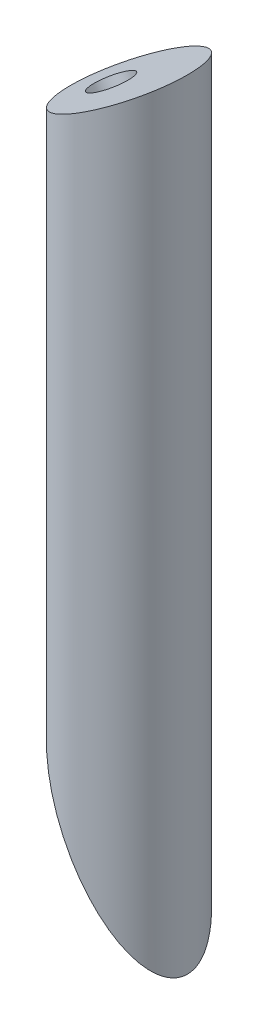
ISO-10303-21;
HEADER;
FILE_DESCRIPTION(('STEP AP214'),'2;1');
FILE_NAME('part.step','',(''),(''),'','','');
FILE_SCHEMA(('AUTOMOTIVE_DESIGN { 1 0 10303 214 1 1 1 1 }'));
ENDSEC;
DATA;
#1=APPLICATION_CONTEXT('core data for automotive mechanical design processes');
#2=APPLICATION_PROTOCOL_DEFINITION('international standard','automotive_design',2000,#1);
#3=PRODUCT_CONTEXT('',#1,'mechanical');
#4=PRODUCT('Part','Part','',(#3));
#5=PRODUCT_RELATED_PRODUCT_CATEGORY('part','',(#4));
#6=PRODUCT_DEFINITION_FORMATION('','',#4);
#7=PRODUCT_DEFINITION_CONTEXT('part definition',#1,'design');
#8=PRODUCT_DEFINITION('design','',#6,#7);
#9=PRODUCT_DEFINITION_SHAPE('','',#8);
#10=(LENGTH_UNIT() NAMED_UNIT(*) SI_UNIT(.MILLI.,.METRE.));
#11=(NAMED_UNIT(*) PLANE_ANGLE_UNIT() SI_UNIT($,.RADIAN.));
#12=(NAMED_UNIT(*) SI_UNIT($,.STERADIAN.) SOLID_ANGLE_UNIT());
#13=UNCERTAINTY_MEASURE_WITH_UNIT(LENGTH_MEASURE(1.E-05),#10,'distance_accuracy_value','');
#14=(GEOMETRIC_REPRESENTATION_CONTEXT(3) GLOBAL_UNCERTAINTY_ASSIGNED_CONTEXT((#13)) GLOBAL_UNIT_ASSIGNED_CONTEXT((#10,
#11,#12)) REPRESENTATION_CONTEXT('',''));
#15=CARTESIAN_POINT('',(0.,0.,0.));
#16=DIRECTION('',(0.,0.,1.));
#17=DIRECTION('',(1.,0.,0.));
#18=AXIS2_PLACEMENT_3D('',#15,#16,#17);
#19=CARTESIAN_POINT('',(0.,100.,0.));
#20=DIRECTION('',(0.,-1.,0.));
#21=DIRECTION('',(0.,0.,-1.));
#22=AXIS2_PLACEMENT_3D('',#19,#20,#21);
#23=CYLINDRICAL_SURFACE('',#22,7.5);
#24=CARTESIAN_POINT('',(0.,12.9903810567666,0.));
#25=DIRECTION('',(0.86602540378444,0.499999999999998,0.));
#26=DIRECTION('',(0.499999999999998,-0.86602540378444,0.));
#27=AXIS2_PLACEMENT_3D('',#24,#25,#26);
#28=ELLIPSE('',#27,15.0000000000001,7.5);
#29=CARTESIAN_POINT('',(7.5,0.,0.));
#30=VERTEX_POINT('',#29);
#31=EDGE_CURVE('E37',#30,#30,#28,.T.);
#32=ORIENTED_EDGE('',*,*,#31,.T.);
#33=EDGE_LOOP('',(#32));
#34=FACE_BOUND('',#33,.T.);
#35=CARTESIAN_POINT('',(0.,95.6698729810778,0.));
#36=DIRECTION('',(0.500000000000001,-0.866025403784438,0.));
#37=DIRECTION('',(-0.866025403784438,-0.500000000000001,0.));
#38=AXIS2_PLACEMENT_3D('',#35,#36,#37);
#39=ELLIPSE('',#38,8.66025403784439,7.5);
#40=CARTESIAN_POINT('',(-7.5,91.3397459621556,0.));
#41=VERTEX_POINT('',#40);
#42=EDGE_CURVE('E10',#41,#41,#39,.T.);
#43=ORIENTED_EDGE('',*,*,#42,.T.);
#44=EDGE_LOOP('',(#43));
#45=FACE_BOUND('',#44,.T.);
#46=ADVANCED_FACE('F31',(#34,#45),#23,.T.);
#47=CARTESIAN_POINT('',(7.5,100.,-50.));
#48=DIRECTION('',(0.500000000000001,-0.866025403784438,0.));
#49=DIRECTION('',(0.866025403784438,0.500000000000001,0.));
#50=AXIS2_PLACEMENT_3D('',#47,#48,#49);
#51=PLANE('',#50);
#52=CARTESIAN_POINT('',(-2.30384757729338,94.3397459621556,0.));
#53=DIRECTION('',(-0.500000000000001,0.866025403784438,0.));
#54=DIRECTION('',(-0.866025403784438,-0.500000000000001,0.));
#55=AXIS2_PLACEMENT_3D('',#52,#53,#54);
#56=CIRCLE('',#55,2.5);
#57=CARTESIAN_POINT('',(-4.46891108675447,93.0897459621556,0.));
#58=VERTEX_POINT('',#57);
#59=EDGE_CURVE('E45',#58,#58,#56,.T.);
#60=ORIENTED_EDGE('',*,*,#59,.F.);
#61=EDGE_LOOP('',(#60));
#62=FACE_BOUND('',#61,.T.);
#63=ORIENTED_EDGE('',*,*,#42,.F.);
#64=EDGE_LOOP('',(#63));
#65=FACE_BOUND('',#64,.T.);
#66=ADVANCED_FACE('F70',(#62,#65),#51,.F.);
#67=CARTESIAN_POINT('',(-21.2216195760604,49.7473043814018,-50.));
#68=DIRECTION('',(0.86602540378444,0.499999999999998,0.));
#69=DIRECTION('',(-0.499999999999998,0.86602540378444,0.));
#70=AXIS2_PLACEMENT_3D('',#67,#68,#69);
#71=PLANE('',#70);
#72=CARTESIAN_POINT('',(-3.50000000000001,19.0525588832578,0.));
#73=DIRECTION('',(-0.86602540378444,-0.499999999999998,0.));
#74=DIRECTION('',(0.499999999999998,-0.86602540378444,0.));
#75=AXIS2_PLACEMENT_3D('',#72,#73,#74);
#76=CIRCLE('',#75,2.5);
#77=CARTESIAN_POINT('',(-2.25000000000002,16.8874953737967,0.));
#78=VERTEX_POINT('',#77);
#79=EDGE_CURVE('E51',#78,#78,#76,.T.);
#80=ORIENTED_EDGE('',*,*,#79,.F.);
#81=EDGE_LOOP('',(#80));
#82=FACE_BOUND('',#81,.T.);
#83=ORIENTED_EDGE('',*,*,#31,.F.);
#84=EDGE_LOOP('',(#83));
#85=FACE_BOUND('',#84,.T.);
#86=ADVANCED_FACE('F66',(#82,#85),#71,.F.);
#87=CARTESIAN_POINT('',(2.69615242270664,85.6794919243112,0.));
#88=DIRECTION('',(-0.500000000000001,0.866025403784438,0.));
#89=DIRECTION('',(-0.866025403784438,-0.500000000000001,0.));
#90=AXIS2_PLACEMENT_3D('',#87,#88,#89);
#91=CYLINDRICAL_SURFACE('',#90,2.5);
#92=CARTESIAN_POINT('',(2.69615242270664,85.6794919243112,0.));
#93=DIRECTION('',(-0.500000000000001,0.866025403784438,0.));
#94=DIRECTION('',(-0.866025403784438,-0.500000000000001,0.));
#95=AXIS2_PLACEMENT_3D('',#92,#93,#94);
#96=CIRCLE('',#95,2.5);
#97=CARTESIAN_POINT('',(0.531088913245541,84.4294919243112,0.));
#98=VERTEX_POINT('',#97);
#99=EDGE_CURVE('E41',#98,#98,#96,.T.);
#100=ORIENTED_EDGE('',*,*,#99,.F.);
#101=EDGE_LOOP('',(#100));
#102=FACE_BOUND('',#101,.T.);
#103=ORIENTED_EDGE('',*,*,#59,.T.);
#104=EDGE_LOOP('',(#103));
#105=FACE_BOUND('',#104,.T.);
#106=ADVANCED_FACE('F69',(#102,#105),#91,.F.);
#107=CARTESIAN_POINT('',(-36.426270189222,63.0921506979639,0.));
#108=DIRECTION('',(-0.500000000000001,0.866025403784438,0.));
#109=DIRECTION('',(-0.866025403784438,-0.500000000000001,0.));
#110=AXIS2_PLACEMENT_3D('',#107,#108,#109);
#111=PLANE('',#110);
#112=ORIENTED_EDGE('',*,*,#99,.T.);
#113=EDGE_LOOP('',(#112));
#114=FACE_BOUND('',#113,.T.);
#115=ADVANCED_FACE('F62',(#114),#111,.T.);
#116=CARTESIAN_POINT('',(2.56217782649106,22.5525588832578,0.));
#117=DIRECTION('',(-0.86602540378444,-0.499999999999998,0.));
#118=DIRECTION('',(0.499999999999998,-0.86602540378444,0.));
#119=AXIS2_PLACEMENT_3D('',#116,#117,#118);
#120=CYLINDRICAL_SURFACE('',#119,2.5);
#121=CARTESIAN_POINT('',(2.56217782649106,22.5525588832578,0.));
#122=DIRECTION('',(-0.86602540378444,-0.499999999999998,0.));
#123=DIRECTION('',(0.499999999999998,-0.86602540378444,0.));
#124=AXIS2_PLACEMENT_3D('',#121,#122,#123);
#125=CIRCLE('',#124,2.5);
#126=CARTESIAN_POINT('',(3.81217782649106,20.3874953737967,0.));
#127=VERTEX_POINT('',#126);
#128=EDGE_CURVE('E49',#127,#127,#125,.T.);
#129=ORIENTED_EDGE('',*,*,#128,.F.);
#130=EDGE_LOOP('',(#129));
#131=FACE_BOUND('',#130,.T.);
#132=ORIENTED_EDGE('',*,*,#79,.T.);
#133=EDGE_LOOP('',(#132));
#134=FACE_BOUND('',#133,.T.);
#135=ADVANCED_FACE('F59',(#131,#134),#120,.F.);
#136=CARTESIAN_POINT('',(2.56217782649106,22.5525588832578,0.));
#137=DIRECTION('',(-0.86602540378444,-0.499999999999998,0.));
#138=DIRECTION('',(0.499999999999998,-0.86602540378444,0.));
#139=AXIS2_PLACEMENT_3D('',#136,#137,#138);
#140=PLANE('',#139);
#141=ORIENTED_EDGE('',*,*,#128,.T.);
#142=EDGE_LOOP('',(#141));
#143=FACE_BOUND('',#142,.T.);
#144=ADVANCED_FACE('F57',(#143),#140,.T.);
#145=CLOSED_SHELL('',(#46,#66,#86,#106,#115,#135,#144));
#146=MANIFOLD_SOLID_BREP('B2',#145);
#147=ADVANCED_BREP_SHAPE_REPRESENTATION('',(#18,#146),#14);
#148=SHAPE_DEFINITION_REPRESENTATION(#9,#147);
ENDSEC;
END-ISO-10303-21;
